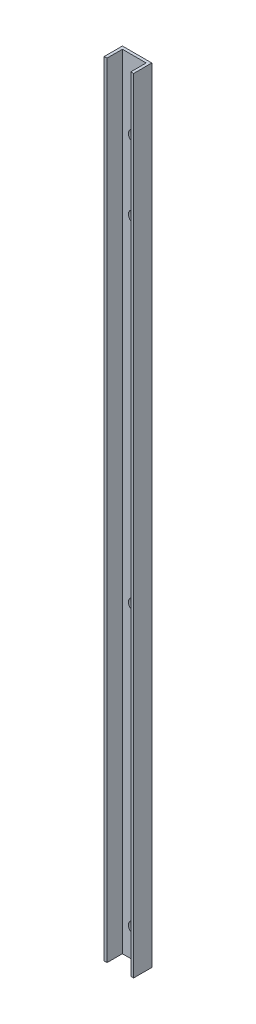
ISO-10303-21;
HEADER;
FILE_DESCRIPTION(('STEP AP214'),'2;1');
FILE_NAME('part.step','',(''),(''),'','','');
FILE_SCHEMA(('AUTOMOTIVE_DESIGN { 1 0 10303 214 1 1 1 1 }'));
ENDSEC;
DATA;
#1=APPLICATION_CONTEXT('core data for automotive mechanical design processes');
#2=APPLICATION_PROTOCOL_DEFINITION('international standard','automotive_design',2000,#1);
#3=PRODUCT_CONTEXT('',#1,'mechanical');
#4=PRODUCT('Part','Part','',(#3));
#5=PRODUCT_RELATED_PRODUCT_CATEGORY('part','',(#4));
#6=PRODUCT_DEFINITION_FORMATION('','',#4);
#7=PRODUCT_DEFINITION_CONTEXT('part definition',#1,'design');
#8=PRODUCT_DEFINITION('design','',#6,#7);
#9=PRODUCT_DEFINITION_SHAPE('','',#8);
#10=(LENGTH_UNIT() NAMED_UNIT(*) SI_UNIT(.MILLI.,.METRE.));
#11=(NAMED_UNIT(*) PLANE_ANGLE_UNIT() SI_UNIT($,.RADIAN.));
#12=(NAMED_UNIT(*) SI_UNIT($,.STERADIAN.) SOLID_ANGLE_UNIT());
#13=UNCERTAINTY_MEASURE_WITH_UNIT(LENGTH_MEASURE(1.E-05),#10,'distance_accuracy_value','');
#14=(GEOMETRIC_REPRESENTATION_CONTEXT(3) GLOBAL_UNCERTAINTY_ASSIGNED_CONTEXT((#13)) GLOBAL_UNIT_ASSIGNED_CONTEXT((#10,
#11,#12)) REPRESENTATION_CONTEXT('',''));
#15=CARTESIAN_POINT('',(0.,0.,0.));
#16=DIRECTION('',(0.,0.,1.));
#17=DIRECTION('',(1.,0.,0.));
#18=AXIS2_PLACEMENT_3D('',#15,#16,#17);
#19=CARTESIAN_POINT('',(6.03004291845494,280.,-4.68669527896996));
#20=DIRECTION('',(1.,0.,0.));
#21=DIRECTION('',(0.,0.,-1.));
#22=AXIS2_PLACEMENT_3D('',#19,#20,#21);
#23=PLANE('',#22);
#24=DIRECTION('',(0.,0.,1.));
#25=VECTOR('',#24,1.);
#26=CARTESIAN_POINT('',(6.03004291845494,0.,-4.68669527896996));
#27=LINE('',#26,#25);
#28=CARTESIAN_POINT('',(6.03004291845494,0.,-3.68669527896996));
#29=VERTEX_POINT('',#28);
#30=CARTESIAN_POINT('',(6.03004291845494,0.,1.81330472103004));
#31=VERTEX_POINT('',#30);
#32=EDGE_CURVE('E131',#29,#31,#27,.T.);
#33=ORIENTED_EDGE('',*,*,#32,.T.);
#34=DIRECTION('',(0.,-1.,0.));
#35=VECTOR('',#34,1.);
#36=CARTESIAN_POINT('',(6.03004291845494,280.,1.81330472103004));
#37=LINE('',#36,#35);
#38=CARTESIAN_POINT('',(6.03004291845494,280.,1.81330472103004));
#39=VERTEX_POINT('',#38);
#40=EDGE_CURVE('E11',#39,#31,#37,.T.);
#41=ORIENTED_EDGE('',*,*,#40,.F.);
#42=DIRECTION('',(0.,0.,1.));
#43=VECTOR('',#42,1.);
#44=CARTESIAN_POINT('',(6.03004291845494,280.,-4.68669527896996));
#45=LINE('',#44,#43);
#46=CARTESIAN_POINT('',(6.03004291845494,280.,-3.68669527896996));
#47=VERTEX_POINT('',#46);
#48=EDGE_CURVE('E89',#47,#39,#45,.T.);
#49=ORIENTED_EDGE('',*,*,#48,.F.);
#50=DIRECTION('',(0.,-1.,0.));
#51=VECTOR('',#50,1.);
#52=CARTESIAN_POINT('',(6.03004291845494,280.,-3.68669527896996));
#53=LINE('',#52,#51);
#54=EDGE_CURVE('E130',#47,#29,#53,.T.);
#55=ORIENTED_EDGE('',*,*,#54,.T.);
#56=EDGE_LOOP('',(#33,#41,#49,#55));
#57=FACE_BOUND('',#56,.T.);
#58=ADVANCED_FACE('F32',(#57),#23,.F.);
#59=CARTESIAN_POINT('',(7.03004291845494,280.,1.81330472103004));
#60=DIRECTION('',(0.,0.,1.));
#61=DIRECTION('',(1.,0.,0.));
#62=AXIS2_PLACEMENT_3D('',#59,#60,#61);
#63=PLANE('',#62);
#64=DIRECTION('',(-1.,0.,0.));
#65=VECTOR('',#64,1.);
#66=CARTESIAN_POINT('',(7.03004291845494,0.,1.81330472103004));
#67=LINE('',#66,#65);
#68=CARTESIAN_POINT('',(7.03004291845494,0.,1.81330472103004));
#69=VERTEX_POINT('',#68);
#70=EDGE_CURVE('E134',#69,#31,#67,.T.);
#71=ORIENTED_EDGE('',*,*,#70,.F.);
#72=DIRECTION('',(0.,-1.,0.));
#73=VECTOR('',#72,1.);
#74=CARTESIAN_POINT('',(7.03004291845494,280.,1.81330472103004));
#75=LINE('',#74,#73);
#76=CARTESIAN_POINT('',(7.03004291845494,280.,1.81330472103004));
#77=VERTEX_POINT('',#76);
#78=EDGE_CURVE('E41',#77,#69,#75,.T.);
#79=ORIENTED_EDGE('',*,*,#78,.F.);
#80=DIRECTION('',(-1.,0.,0.));
#81=VECTOR('',#80,1.);
#82=CARTESIAN_POINT('',(7.03004291845494,280.,1.81330472103004));
#83=LINE('',#82,#81);
#84=EDGE_CURVE('E182',#77,#39,#83,.T.);
#85=ORIENTED_EDGE('',*,*,#84,.T.);
#86=ORIENTED_EDGE('',*,*,#40,.T.);
#87=EDGE_LOOP('',(#71,#79,#85,#86));
#88=FACE_BOUND('',#87,.T.);
#89=ADVANCED_FACE('F215',(#88),#63,.T.);
#90=CARTESIAN_POINT('',(7.03004291845494,280.,-4.68669527896996));
#91=DIRECTION('',(1.,0.,0.));
#92=DIRECTION('',(0.,0.,-1.));
#93=AXIS2_PLACEMENT_3D('',#90,#91,#92);
#94=PLANE('',#93);
#95=DIRECTION('',(0.,0.,1.));
#96=VECTOR('',#95,1.);
#97=CARTESIAN_POINT('',(7.03004291845494,0.,-4.68669527896996));
#98=LINE('',#97,#96);
#99=CARTESIAN_POINT('',(7.03004291845494,0.,-4.68669527896996));
#100=VERTEX_POINT('',#99);
#101=EDGE_CURVE('E138',#100,#69,#98,.T.);
#102=ORIENTED_EDGE('',*,*,#101,.F.);
#103=DIRECTION('',(0.,-1.,0.));
#104=VECTOR('',#103,1.);
#105=CARTESIAN_POINT('',(7.03004291845494,280.,-4.68669527896996));
#106=LINE('',#105,#104);
#107=CARTESIAN_POINT('',(7.03004291845494,280.,-4.68669527896996));
#108=VERTEX_POINT('',#107);
#109=EDGE_CURVE('E155',#108,#100,#106,.T.);
#110=ORIENTED_EDGE('',*,*,#109,.F.);
#111=DIRECTION('',(0.,0.,1.));
#112=VECTOR('',#111,1.);
#113=CARTESIAN_POINT('',(7.03004291845494,280.,-4.68669527896996));
#114=LINE('',#113,#112);
#115=EDGE_CURVE('E185',#108,#77,#114,.T.);
#116=ORIENTED_EDGE('',*,*,#115,.T.);
#117=ORIENTED_EDGE('',*,*,#78,.T.);
#118=EDGE_LOOP('',(#102,#110,#116,#117));
#119=FACE_BOUND('',#118,.T.);
#120=ADVANCED_FACE('F219',(#119),#94,.T.);
#121=CARTESIAN_POINT('',(-3.46995708154506,280.,-4.68669527896996));
#122=DIRECTION('',(0.,0.,-1.));
#123=DIRECTION('',(-1.,0.,0.));
#124=AXIS2_PLACEMENT_3D('',#121,#122,#123);
#125=PLANE('',#124);
#126=CARTESIAN_POINT('',(1.78004291845504,9.99999999999993,-4.68669527896996));
#127=DIRECTION('',(0.,0.,-1.));
#128=DIRECTION('',(-1.,0.,0.));
#129=AXIS2_PLACEMENT_3D('',#126,#127,#128);
#130=CIRCLE('',#129,2.1);
#131=CARTESIAN_POINT('',(-0.319957081544957,9.99999999999993,-4.68669527896996));
#132=VERTEX_POINT('',#131);
#133=EDGE_CURVE('E176',#132,#132,#130,.T.);
#134=ORIENTED_EDGE('',*,*,#133,.F.);
#135=EDGE_LOOP('',(#134));
#136=FACE_BOUND('',#135,.T.);
#137=CARTESIAN_POINT('',(1.78004291845503,110.,-4.68669527896996));
#138=DIRECTION('',(0.,0.,-1.));
#139=DIRECTION('',(-1.,0.,0.));
#140=AXIS2_PLACEMENT_3D('',#137,#138,#139);
#141=CIRCLE('',#140,2.1);
#142=CARTESIAN_POINT('',(-0.319957081544972,110.,-4.68669527896996));
#143=VERTEX_POINT('',#142);
#144=EDGE_CURVE('E166',#143,#143,#141,.T.);
#145=ORIENTED_EDGE('',*,*,#144,.F.);
#146=EDGE_LOOP('',(#145));
#147=FACE_BOUND('',#146,.T.);
#148=CARTESIAN_POINT('',(1.780042918455,255.,-4.68669527896996));
#149=DIRECTION('',(0.,0.,-1.));
#150=DIRECTION('',(-1.,0.,0.));
#151=AXIS2_PLACEMENT_3D('',#148,#149,#150);
#152=CIRCLE('',#151,2.1);
#153=CARTESIAN_POINT('',(-0.319957081545003,255.,-4.68669527896996));
#154=VERTEX_POINT('',#153);
#155=EDGE_CURVE('E163',#154,#154,#152,.T.);
#156=ORIENTED_EDGE('',*,*,#155,.F.);
#157=EDGE_LOOP('',(#156));
#158=FACE_BOUND('',#157,.T.);
#159=CARTESIAN_POINT('',(1.780042918455,230.,-4.68669527896996));
#160=DIRECTION('',(0.,0.,-1.));
#161=DIRECTION('',(-1.,0.,0.));
#162=AXIS2_PLACEMENT_3D('',#159,#160,#161);
#163=CIRCLE('',#162,2.1);
#164=CARTESIAN_POINT('',(-0.319957081545,230.,-4.68669527896996));
#165=VERTEX_POINT('',#164);
#166=EDGE_CURVE('E160',#165,#165,#163,.T.);
#167=ORIENTED_EDGE('',*,*,#166,.F.);
#168=EDGE_LOOP('',(#167));
#169=FACE_BOUND('',#168,.T.);
#170=DIRECTION('',(1.,0.,0.));
#171=VECTOR('',#170,1.);
#172=CARTESIAN_POINT('',(-3.46995708154506,0.,-4.68669527896996));
#173=LINE('',#172,#171);
#174=CARTESIAN_POINT('',(-3.46995708154506,0.,-4.68669527896996));
#175=VERTEX_POINT('',#174);
#176=EDGE_CURVE('E141',#175,#100,#173,.T.);
#177=ORIENTED_EDGE('',*,*,#176,.F.);
#178=DIRECTION('',(0.,-1.,0.));
#179=VECTOR('',#178,1.);
#180=CARTESIAN_POINT('',(-3.46995708154506,280.,-4.68669527896996));
#181=LINE('',#180,#179);
#182=CARTESIAN_POINT('',(-3.46995708154506,280.,-4.68669527896996));
#183=VERTEX_POINT('',#182);
#184=EDGE_CURVE('E153',#183,#175,#181,.T.);
#185=ORIENTED_EDGE('',*,*,#184,.F.);
#186=DIRECTION('',(1.,0.,0.));
#187=VECTOR('',#186,1.);
#188=CARTESIAN_POINT('',(-3.46995708154506,280.,-4.68669527896996));
#189=LINE('',#188,#187);
#190=EDGE_CURVE('E125',#183,#108,#189,.T.);
#191=ORIENTED_EDGE('',*,*,#190,.T.);
#192=ORIENTED_EDGE('',*,*,#109,.T.);
#193=EDGE_LOOP('',(#177,#185,#191,#192));
#194=FACE_BOUND('',#193,.T.);
#195=ADVANCED_FACE('F190',(#136,#147,#158,#169,#194),#125,.T.);
#196=CARTESIAN_POINT('',(-3.46995708154506,280.,1.81330472103004));
#197=DIRECTION('',(-1.,0.,0.));
#198=DIRECTION('',(0.,0.,1.));
#199=AXIS2_PLACEMENT_3D('',#196,#197,#198);
#200=PLANE('',#199);
#201=DIRECTION('',(0.,0.,-1.));
#202=VECTOR('',#201,1.);
#203=CARTESIAN_POINT('',(-3.46995708154506,0.,1.81330472103004));
#204=LINE('',#203,#202);
#205=CARTESIAN_POINT('',(-3.46995708154506,0.,1.81330472103004));
#206=VERTEX_POINT('',#205);
#207=EDGE_CURVE('E144',#206,#175,#204,.T.);
#208=ORIENTED_EDGE('',*,*,#207,.F.);
#209=DIRECTION('',(0.,-1.,0.));
#210=VECTOR('',#209,1.);
#211=CARTESIAN_POINT('',(-3.46995708154506,280.,1.81330472103004));
#212=LINE('',#211,#210);
#213=CARTESIAN_POINT('',(-3.46995708154506,280.,1.81330472103004));
#214=VERTEX_POINT('',#213);
#215=EDGE_CURVE('E113',#214,#206,#212,.T.);
#216=ORIENTED_EDGE('',*,*,#215,.F.);
#217=DIRECTION('',(0.,0.,-1.));
#218=VECTOR('',#217,1.);
#219=CARTESIAN_POINT('',(-3.46995708154506,280.,1.81330472103004));
#220=LINE('',#219,#218);
#221=EDGE_CURVE('E123',#214,#183,#220,.T.);
#222=ORIENTED_EDGE('',*,*,#221,.T.);
#223=ORIENTED_EDGE('',*,*,#184,.T.);
#224=EDGE_LOOP('',(#208,#216,#222,#223));
#225=FACE_BOUND('',#224,.T.);
#226=ADVANCED_FACE('F195',(#225),#200,.T.);
#227=CARTESIAN_POINT('',(-2.46995708154506,280.,1.81330472103004));
#228=DIRECTION('',(0.,0.,1.));
#229=DIRECTION('',(1.,0.,0.));
#230=AXIS2_PLACEMENT_3D('',#227,#228,#229);
#231=PLANE('',#230);
#232=DIRECTION('',(-1.,0.,0.));
#233=VECTOR('',#232,1.);
#234=CARTESIAN_POINT('',(-2.46995708154506,0.,1.81330472103004));
#235=LINE('',#234,#233);
#236=CARTESIAN_POINT('',(-2.46995708154506,0.,1.81330472103004));
#237=VERTEX_POINT('',#236);
#238=EDGE_CURVE('E112',#237,#206,#235,.T.);
#239=ORIENTED_EDGE('',*,*,#238,.F.);
#240=DIRECTION('',(0.,-1.,0.));
#241=VECTOR('',#240,1.);
#242=CARTESIAN_POINT('',(-2.46995708154506,280.,1.81330472103004));
#243=LINE('',#242,#241);
#244=CARTESIAN_POINT('',(-2.46995708154506,280.,1.81330472103004));
#245=VERTEX_POINT('',#244);
#246=EDGE_CURVE('E106',#245,#237,#243,.T.);
#247=ORIENTED_EDGE('',*,*,#246,.F.);
#248=DIRECTION('',(-1.,0.,0.));
#249=VECTOR('',#248,1.);
#250=CARTESIAN_POINT('',(-2.46995708154506,280.,1.81330472103004));
#251=LINE('',#250,#249);
#252=EDGE_CURVE('E110',#245,#214,#251,.T.);
#253=ORIENTED_EDGE('',*,*,#252,.T.);
#254=ORIENTED_EDGE('',*,*,#215,.T.);
#255=EDGE_LOOP('',(#239,#247,#253,#254));
#256=FACE_BOUND('',#255,.T.);
#257=ADVANCED_FACE('F108',(#256),#231,.T.);
#258=CARTESIAN_POINT('',(-2.46995708154506,280.,1.81330472103004));
#259=DIRECTION('',(-1.,0.,0.));
#260=DIRECTION('',(0.,0.,1.));
#261=AXIS2_PLACEMENT_3D('',#258,#259,#260);
#262=PLANE('',#261);
#263=DIRECTION('',(0.,0.,-1.));
#264=VECTOR('',#263,1.);
#265=CARTESIAN_POINT('',(-2.46995708154506,0.,1.81330472103004));
#266=LINE('',#265,#264);
#267=CARTESIAN_POINT('',(-2.46995708154506,0.,-3.68669527896996));
#268=VERTEX_POINT('',#267);
#269=EDGE_CURVE('E77',#237,#268,#266,.T.);
#270=ORIENTED_EDGE('',*,*,#269,.T.);
#271=DIRECTION('',(0.,-1.,0.));
#272=VECTOR('',#271,1.);
#273=CARTESIAN_POINT('',(-2.46995708154506,280.,-3.68669527896996));
#274=LINE('',#273,#272);
#275=CARTESIAN_POINT('',(-2.46995708154506,280.,-3.68669527896996));
#276=VERTEX_POINT('',#275);
#277=EDGE_CURVE('E114',#276,#268,#274,.T.);
#278=ORIENTED_EDGE('',*,*,#277,.F.);
#279=DIRECTION('',(0.,0.,-1.));
#280=VECTOR('',#279,1.);
#281=CARTESIAN_POINT('',(-2.46995708154506,280.,1.81330472103004));
#282=LINE('',#281,#280);
#283=EDGE_CURVE('E116',#245,#276,#282,.T.);
#284=ORIENTED_EDGE('',*,*,#283,.F.);
#285=ORIENTED_EDGE('',*,*,#246,.T.);
#286=EDGE_LOOP('',(#270,#278,#284,#285));
#287=FACE_BOUND('',#286,.T.);
#288=ADVANCED_FACE('F117',(#287),#262,.F.);
#289=CARTESIAN_POINT('',(-3.46995708154506,280.,-3.68669527896996));
#290=DIRECTION('',(0.,0.,-1.));
#291=DIRECTION('',(-1.,0.,0.));
#292=AXIS2_PLACEMENT_3D('',#289,#290,#291);
#293=PLANE('',#292);
#294=CARTESIAN_POINT('',(1.78004291845504,9.99999999999993,-3.68669527896996));
#295=DIRECTION('',(0.,0.,-1.));
#296=DIRECTION('',(-1.,0.,0.));
#297=AXIS2_PLACEMENT_3D('',#294,#295,#296);
#298=CIRCLE('',#297,2.1);
#299=CARTESIAN_POINT('',(-0.319957081544957,9.99999999999993,-3.68669527896996));
#300=VERTEX_POINT('',#299);
#301=EDGE_CURVE('E35',#300,#300,#298,.T.);
#302=ORIENTED_EDGE('',*,*,#301,.T.);
#303=EDGE_LOOP('',(#302));
#304=FACE_BOUND('',#303,.T.);
#305=CARTESIAN_POINT('',(1.78004291845503,110.,-3.68669527896996));
#306=DIRECTION('',(0.,0.,-1.));
#307=DIRECTION('',(-1.,0.,0.));
#308=AXIS2_PLACEMENT_3D('',#305,#306,#307);
#309=CIRCLE('',#308,2.1);
#310=CARTESIAN_POINT('',(-0.319957081544972,110.,-3.68669527896996));
#311=VERTEX_POINT('',#310);
#312=EDGE_CURVE('E164',#311,#311,#309,.T.);
#313=ORIENTED_EDGE('',*,*,#312,.T.);
#314=EDGE_LOOP('',(#313));
#315=FACE_BOUND('',#314,.T.);
#316=CARTESIAN_POINT('',(1.780042918455,255.,-3.68669527896996));
#317=DIRECTION('',(0.,0.,-1.));
#318=DIRECTION('',(-1.,0.,0.));
#319=AXIS2_PLACEMENT_3D('',#316,#317,#318);
#320=CIRCLE('',#319,2.1);
#321=CARTESIAN_POINT('',(-0.319957081545003,255.,-3.68669527896996));
#322=VERTEX_POINT('',#321);
#323=EDGE_CURVE('E161',#322,#322,#320,.T.);
#324=ORIENTED_EDGE('',*,*,#323,.T.);
#325=EDGE_LOOP('',(#324));
#326=FACE_BOUND('',#325,.T.);
#327=CARTESIAN_POINT('',(1.780042918455,230.,-3.68669527896996));
#328=DIRECTION('',(0.,0.,-1.));
#329=DIRECTION('',(-1.,0.,0.));
#330=AXIS2_PLACEMENT_3D('',#327,#328,#329);
#331=CIRCLE('',#330,2.1);
#332=CARTESIAN_POINT('',(-0.319957081545,230.,-3.68669527896996));
#333=VERTEX_POINT('',#332);
#334=EDGE_CURVE('E135',#333,#333,#331,.T.);
#335=ORIENTED_EDGE('',*,*,#334,.T.);
#336=EDGE_LOOP('',(#335));
#337=FACE_BOUND('',#336,.T.);
#338=DIRECTION('',(1.,0.,0.));
#339=VECTOR('',#338,1.);
#340=CARTESIAN_POINT('',(-3.46995708154506,0.,-3.68669527896996));
#341=LINE('',#340,#339);
#342=EDGE_CURVE('E83',#268,#29,#341,.T.);
#343=ORIENTED_EDGE('',*,*,#342,.T.);
#344=ORIENTED_EDGE('',*,*,#54,.F.);
#345=DIRECTION('',(1.,0.,0.));
#346=VECTOR('',#345,1.);
#347=CARTESIAN_POINT('',(-3.46995708154506,280.,-3.68669527896996));
#348=LINE('',#347,#346);
#349=EDGE_CURVE('E50',#276,#47,#348,.T.);
#350=ORIENTED_EDGE('',*,*,#349,.F.);
#351=ORIENTED_EDGE('',*,*,#277,.T.);
#352=EDGE_LOOP('',(#343,#344,#350,#351));
#353=FACE_BOUND('',#352,.T.);
#354=ADVANCED_FACE('F201',(#304,#315,#326,#337,#353),#293,.F.);
#355=CARTESIAN_POINT('',(0.,280.,0.));
#356=DIRECTION('',(0.,-1.,0.));
#357=DIRECTION('',(-1.,0.,0.));
#358=AXIS2_PLACEMENT_3D('',#355,#356,#357);
#359=PLANE('',#358);
#360=ORIENTED_EDGE('',*,*,#48,.T.);
#361=ORIENTED_EDGE('',*,*,#84,.F.);
#362=ORIENTED_EDGE('',*,*,#115,.F.);
#363=ORIENTED_EDGE('',*,*,#190,.F.);
#364=ORIENTED_EDGE('',*,*,#221,.F.);
#365=ORIENTED_EDGE('',*,*,#252,.F.);
#366=ORIENTED_EDGE('',*,*,#283,.T.);
#367=ORIENTED_EDGE('',*,*,#349,.T.);
#368=EDGE_LOOP('',(#360,#361,#362,#363,#364,#365,#366,#367));
#369=FACE_BOUND('',#368,.T.);
#370=ADVANCED_FACE('F120',(#369),#359,.F.);
#371=CARTESIAN_POINT('',(0.,0.,0.));
#372=DIRECTION('',(0.,-1.,0.));
#373=DIRECTION('',(-1.,0.,0.));
#374=AXIS2_PLACEMENT_3D('',#371,#372,#373);
#375=PLANE('',#374);
#376=ORIENTED_EDGE('',*,*,#32,.F.);
#377=ORIENTED_EDGE('',*,*,#342,.F.);
#378=ORIENTED_EDGE('',*,*,#269,.F.);
#379=ORIENTED_EDGE('',*,*,#238,.T.);
#380=ORIENTED_EDGE('',*,*,#207,.T.);
#381=ORIENTED_EDGE('',*,*,#176,.T.);
#382=ORIENTED_EDGE('',*,*,#101,.T.);
#383=ORIENTED_EDGE('',*,*,#70,.T.);
#384=EDGE_LOOP('',(#376,#377,#378,#379,#380,#381,#382,#383));
#385=FACE_BOUND('',#384,.T.);
#386=ADVANCED_FACE('F198',(#385),#375,.T.);
#387=CARTESIAN_POINT('',(1.780042918455,230.,5.31330472103004));
#388=DIRECTION('',(0.,0.,-1.));
#389=DIRECTION('',(-1.,0.,0.));
#390=AXIS2_PLACEMENT_3D('',#387,#388,#389);
#391=CYLINDRICAL_SURFACE('',#390,2.1);
#392=ORIENTED_EDGE('',*,*,#166,.T.);
#393=EDGE_LOOP('',(#392));
#394=FACE_BOUND('',#393,.T.);
#395=ORIENTED_EDGE('',*,*,#334,.F.);
#396=EDGE_LOOP('',(#395));
#397=FACE_BOUND('',#396,.T.);
#398=ADVANCED_FACE('F255',(#394,#397),#391,.F.);
#399=CARTESIAN_POINT('',(1.780042918455,255.,5.31330472103004));
#400=DIRECTION('',(0.,0.,-1.));
#401=DIRECTION('',(-1.,0.,0.));
#402=AXIS2_PLACEMENT_3D('',#399,#400,#401);
#403=CYLINDRICAL_SURFACE('',#402,2.1);
#404=ORIENTED_EDGE('',*,*,#155,.T.);
#405=EDGE_LOOP('',(#404));
#406=FACE_BOUND('',#405,.T.);
#407=ORIENTED_EDGE('',*,*,#323,.F.);
#408=EDGE_LOOP('',(#407));
#409=FACE_BOUND('',#408,.T.);
#410=ADVANCED_FACE('F260',(#406,#409),#403,.F.);
#411=CARTESIAN_POINT('',(1.78004291845503,110.,5.31330472103004));
#412=DIRECTION('',(0.,0.,-1.));
#413=DIRECTION('',(-1.,0.,0.));
#414=AXIS2_PLACEMENT_3D('',#411,#412,#413);
#415=CYLINDRICAL_SURFACE('',#414,2.1);
#416=ORIENTED_EDGE('',*,*,#144,.T.);
#417=EDGE_LOOP('',(#416));
#418=FACE_BOUND('',#417,.T.);
#419=ORIENTED_EDGE('',*,*,#312,.F.);
#420=EDGE_LOOP('',(#419));
#421=FACE_BOUND('',#420,.T.);
#422=ADVANCED_FACE('F268',(#418,#421),#415,.F.);
#423=CARTESIAN_POINT('',(1.78004291845504,9.99999999999993,5.31330472103004));
#424=DIRECTION('',(0.,0.,-1.));
#425=DIRECTION('',(-1.,0.,0.));
#426=AXIS2_PLACEMENT_3D('',#423,#424,#425);
#427=CYLINDRICAL_SURFACE('',#426,2.1);
#428=ORIENTED_EDGE('',*,*,#133,.T.);
#429=EDGE_LOOP('',(#428));
#430=FACE_BOUND('',#429,.T.);
#431=ORIENTED_EDGE('',*,*,#301,.F.);
#432=EDGE_LOOP('',(#431));
#433=FACE_BOUND('',#432,.T.);
#434=ADVANCED_FACE('F276',(#430,#433),#427,.F.);
#435=CLOSED_SHELL('',(#58,#89,#120,#195,#226,#257,#288,#354,#370,#386,#398,#410,#422,#434));
#436=MANIFOLD_SOLID_BREP('B2',#435);
#437=ADVANCED_BREP_SHAPE_REPRESENTATION('',(#18,#436),#14);
#438=SHAPE_DEFINITION_REPRESENTATION(#9,#437);
ENDSEC;
END-ISO-10303-21;
